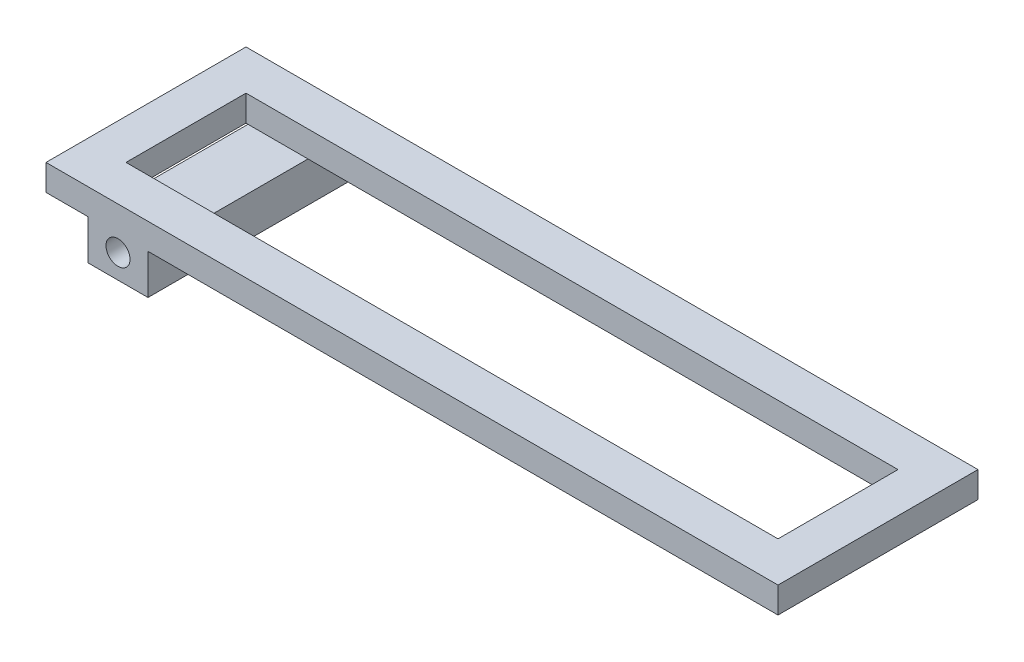
ISO-10303-21;
HEADER;
FILE_DESCRIPTION(('STEP AP214'),'2;1');
FILE_NAME('part.step','',(''),(''),'','','');
FILE_SCHEMA(('AUTOMOTIVE_DESIGN { 1 0 10303 214 1 1 1 1 }'));
ENDSEC;
DATA;
#1=APPLICATION_CONTEXT('core data for automotive mechanical design processes');
#2=APPLICATION_PROTOCOL_DEFINITION('international standard','automotive_design',2000,#1);
#3=PRODUCT_CONTEXT('',#1,'mechanical');
#4=PRODUCT('Part','Part','',(#3));
#5=PRODUCT_RELATED_PRODUCT_CATEGORY('part','',(#4));
#6=PRODUCT_DEFINITION_FORMATION('','',#4);
#7=PRODUCT_DEFINITION_CONTEXT('part definition',#1,'design');
#8=PRODUCT_DEFINITION('design','',#6,#7);
#9=PRODUCT_DEFINITION_SHAPE('','',#8);
#10=(LENGTH_UNIT() NAMED_UNIT(*) SI_UNIT(.MILLI.,.METRE.));
#11=(NAMED_UNIT(*) PLANE_ANGLE_UNIT() SI_UNIT($,.RADIAN.));
#12=(NAMED_UNIT(*) SI_UNIT($,.STERADIAN.) SOLID_ANGLE_UNIT());
#13=UNCERTAINTY_MEASURE_WITH_UNIT(LENGTH_MEASURE(1.E-05),#10,'distance_accuracy_value','');
#14=(GEOMETRIC_REPRESENTATION_CONTEXT(3) GLOBAL_UNCERTAINTY_ASSIGNED_CONTEXT((#13)) GLOBAL_UNIT_ASSIGNED_CONTEXT((#10,
#11,#12)) REPRESENTATION_CONTEXT('',''));
#15=CARTESIAN_POINT('',(0.,0.,0.));
#16=DIRECTION('',(0.,0.,1.));
#17=DIRECTION('',(1.,0.,0.));
#18=AXIS2_PLACEMENT_3D('',#15,#16,#17);
#19=CARTESIAN_POINT('',(0.,0.,-10.));
#20=DIRECTION('',(0.,-1.,0.));
#21=DIRECTION('',(0.,0.,-1.));
#22=AXIS2_PLACEMENT_3D('',#19,#20,#21);
#23=PLANE('',#22);
#24=DIRECTION('',(1.,0.,0.));
#25=VECTOR('',#24,1.);
#26=CARTESIAN_POINT('',(0.,0.,0.));
#27=LINE('',#26,#25);
#28=CARTESIAN_POINT('',(25.5,0.,0.));
#29=VERTEX_POINT('',#28);
#30=CARTESIAN_POINT('',(183.,0.,0.));
#31=VERTEX_POINT('',#30);
#32=EDGE_CURVE('E228',#29,#31,#27,.T.);
#33=ORIENTED_EDGE('',*,*,#32,.F.);
#34=DIRECTION('',(0.,0.,-1.));
#35=VECTOR('',#34,1.);
#36=CARTESIAN_POINT('',(25.5,0.,0.));
#37=LINE('',#36,#35);
#38=CARTESIAN_POINT('',(25.5,0.,-10.));
#39=VERTEX_POINT('',#38);
#40=EDGE_CURVE('E167',#29,#39,#37,.T.);
#41=ORIENTED_EDGE('',*,*,#40,.T.);
#42=DIRECTION('',(1.,0.,0.));
#43=VECTOR('',#42,1.);
#44=CARTESIAN_POINT('',(0.,0.,-10.));
#45=LINE('',#44,#43);
#46=CARTESIAN_POINT('',(173.,0.,-10.));
#47=VERTEX_POINT('',#46);
#48=EDGE_CURVE('E216',#39,#47,#45,.T.);
#49=ORIENTED_EDGE('',*,*,#48,.T.);
#50=DIRECTION('',(0.,0.,1.));
#51=VECTOR('',#50,1.);
#52=CARTESIAN_POINT('',(173.,0.,-50.));
#53=LINE('',#52,#51);
#54=CARTESIAN_POINT('',(173.,0.,-40.));
#55=VERTEX_POINT('',#54);
#56=EDGE_CURVE('E209',#55,#47,#53,.T.);
#57=ORIENTED_EDGE('',*,*,#56,.F.);
#58=DIRECTION('',(-1.,0.,0.));
#59=VECTOR('',#58,1.);
#60=CARTESIAN_POINT('',(183.002,0.,-40.));
#61=LINE('',#60,#59);
#62=CARTESIAN_POINT('',(25.5,0.,-40.));
#63=VERTEX_POINT('',#62);
#64=EDGE_CURVE('E179',#55,#63,#61,.T.);
#65=ORIENTED_EDGE('',*,*,#64,.T.);
#66=CARTESIAN_POINT('',(25.5,0.,-50.));
#67=VERTEX_POINT('',#66);
#68=EDGE_CURVE('E44',#63,#67,#37,.T.);
#69=ORIENTED_EDGE('',*,*,#68,.T.);
#70=DIRECTION('',(-1.,0.,0.));
#71=VECTOR('',#70,1.);
#72=CARTESIAN_POINT('',(183.,0.,-50.));
#73=LINE('',#72,#71);
#74=CARTESIAN_POINT('',(183.,0.,-50.));
#75=VERTEX_POINT('',#74);
#76=EDGE_CURVE('E155',#75,#67,#73,.T.);
#77=ORIENTED_EDGE('',*,*,#76,.F.);
#78=DIRECTION('',(0.,0.,1.));
#79=VECTOR('',#78,1.);
#80=CARTESIAN_POINT('',(183.,0.,-10.));
#81=LINE('',#80,#79);
#82=EDGE_CURVE('E236',#75,#31,#81,.T.);
#83=ORIENTED_EDGE('',*,*,#82,.T.);
#84=EDGE_LOOP('',(#33,#41,#49,#57,#65,#69,#77,#83));
#85=FACE_BOUND('',#84,.T.);
#86=ADVANCED_FACE('F35',(#85),#23,.T.);
#87=CARTESIAN_POINT('',(173.,6.5,-50.));
#88=DIRECTION('',(1.,0.,0.));
#89=DIRECTION('',(0.,0.,-1.));
#90=AXIS2_PLACEMENT_3D('',#87,#88,#89);
#91=PLANE('',#90);
#92=DIRECTION('',(0.,-1.,0.));
#93=VECTOR('',#92,1.);
#94=CARTESIAN_POINT('',(173.,6.49999999999995,-40.));
#95=LINE('',#94,#93);
#96=CARTESIAN_POINT('',(173.,6.49999999999996,-40.));
#97=VERTEX_POINT('',#96);
#98=EDGE_CURVE('E156',#97,#55,#95,.T.);
#99=ORIENTED_EDGE('',*,*,#98,.T.);
#100=ORIENTED_EDGE('',*,*,#56,.T.);
#101=DIRECTION('',(0.,1.,0.));
#102=VECTOR('',#101,1.);
#103=CARTESIAN_POINT('',(173.,6.5,-10.));
#104=LINE('',#103,#102);
#105=CARTESIAN_POINT('',(173.,6.5,-10.));
#106=VERTEX_POINT('',#105);
#107=EDGE_CURVE('E197',#47,#106,#104,.T.);
#108=ORIENTED_EDGE('',*,*,#107,.T.);
#109=DIRECTION('',(0.,0.,1.));
#110=VECTOR('',#109,1.);
#111=CARTESIAN_POINT('',(173.,6.5,-50.));
#112=LINE('',#111,#110);
#113=EDGE_CURVE('E205',#97,#106,#112,.T.);
#114=ORIENTED_EDGE('',*,*,#113,.F.);
#115=EDGE_LOOP('',(#99,#100,#108,#114));
#116=FACE_BOUND('',#115,.T.);
#117=ADVANCED_FACE('F265',(#116),#91,.F.);
#118=CARTESIAN_POINT('',(10.,6.5,-50.));
#119=DIRECTION('',(-1.,0.,0.));
#120=DIRECTION('',(0.,-1.,0.));
#121=AXIS2_PLACEMENT_3D('',#118,#119,#120);
#122=PLANE('',#121);
#123=DIRECTION('',(0.,-1.,0.));
#124=VECTOR('',#123,1.);
#125=CARTESIAN_POINT('',(10.,6.5,-40.));
#126=LINE('',#125,#124);
#127=CARTESIAN_POINT('',(10.,6.5,-40.));
#128=VERTEX_POINT('',#127);
#129=CARTESIAN_POINT('',(10.,0.,-40.));
#130=VERTEX_POINT('',#129);
#131=EDGE_CURVE('E175',#128,#130,#126,.T.);
#132=ORIENTED_EDGE('',*,*,#131,.F.);
#133=DIRECTION('',(0.,0.,1.));
#134=VECTOR('',#133,1.);
#135=CARTESIAN_POINT('',(10.,6.5,-50.));
#136=LINE('',#135,#134);
#137=CARTESIAN_POINT('',(10.,6.5,-10.));
#138=VERTEX_POINT('',#137);
#139=EDGE_CURVE('E195',#128,#138,#136,.T.);
#140=ORIENTED_EDGE('',*,*,#139,.T.);
#141=DIRECTION('',(0.,-1.,0.));
#142=VECTOR('',#141,1.);
#143=CARTESIAN_POINT('',(10.,6.5,-10.));
#144=LINE('',#143,#142);
#145=CARTESIAN_POINT('',(10.,0.,-10.));
#146=VERTEX_POINT('',#145);
#147=EDGE_CURVE('E178',#138,#146,#144,.T.);
#148=ORIENTED_EDGE('',*,*,#147,.T.);
#149=DIRECTION('',(0.,0.,1.));
#150=VECTOR('',#149,1.);
#151=CARTESIAN_POINT('',(10.,0.,-50.));
#152=LINE('',#151,#150);
#153=EDGE_CURVE('E191',#130,#146,#152,.T.);
#154=ORIENTED_EDGE('',*,*,#153,.F.);
#155=EDGE_LOOP('',(#132,#140,#148,#154));
#156=FACE_BOUND('',#155,.T.);
#157=ADVANCED_FACE('F271',(#156),#122,.F.);
#158=CARTESIAN_POINT('',(0.,0.,-10.));
#159=DIRECTION('',(0.,0.,1.));
#160=DIRECTION('',(1.,0.,0.));
#161=AXIS2_PLACEMENT_3D('',#158,#159,#160);
#162=PLANE('',#161);
#163=ORIENTED_EDGE('',*,*,#147,.F.);
#164=DIRECTION('',(1.,0.,0.));
#165=VECTOR('',#164,1.);
#166=CARTESIAN_POINT('',(0.,6.5,-10.));
#167=LINE('',#166,#165);
#168=EDGE_CURVE('E213',#138,#106,#167,.T.);
#169=ORIENTED_EDGE('',*,*,#168,.T.);
#170=ORIENTED_EDGE('',*,*,#107,.F.);
#171=ORIENTED_EDGE('',*,*,#48,.F.);
#172=CARTESIAN_POINT('',(10.5,0.,-10.));
#173=VERTEX_POINT('',#172);
#174=EDGE_CURVE('E222',#173,#39,#45,.T.);
#175=ORIENTED_EDGE('',*,*,#174,.F.);
#176=EDGE_CURVE('E218',#146,#173,#45,.T.);
#177=ORIENTED_EDGE('',*,*,#176,.F.);
#178=EDGE_LOOP('',(#163,#169,#170,#171,#175,#177));
#179=FACE_BOUND('',#178,.T.);
#180=ADVANCED_FACE('F303',(#179),#162,.F.);
#181=CARTESIAN_POINT('',(0.,6.5,-10.));
#182=DIRECTION('',(0.,-1.,0.));
#183=DIRECTION('',(0.,0.,-1.));
#184=AXIS2_PLACEMENT_3D('',#181,#182,#183);
#185=PLANE('',#184);
#186=DIRECTION('',(-1.,0.,0.));
#187=VECTOR('',#186,1.);
#188=CARTESIAN_POINT('',(183.002,6.49999999999995,-40.));
#189=LINE('',#188,#187);
#190=EDGE_CURVE('E180',#97,#128,#189,.T.);
#191=ORIENTED_EDGE('',*,*,#190,.F.);
#192=ORIENTED_EDGE('',*,*,#113,.T.);
#193=ORIENTED_EDGE('',*,*,#168,.F.);
#194=ORIENTED_EDGE('',*,*,#139,.F.);
#195=EDGE_LOOP('',(#191,#192,#193,#194));
#196=FACE_BOUND('',#195,.T.);
#197=DIRECTION('',(1.,0.,0.));
#198=VECTOR('',#197,1.);
#199=CARTESIAN_POINT('',(0.,6.5,0.));
#200=LINE('',#199,#198);
#201=CARTESIAN_POINT('',(0.,6.5,0.));
#202=VERTEX_POINT('',#201);
#203=CARTESIAN_POINT('',(183.,6.5,0.));
#204=VERTEX_POINT('',#203);
#205=EDGE_CURVE('E212',#202,#204,#200,.T.);
#206=ORIENTED_EDGE('',*,*,#205,.T.);
#207=DIRECTION('',(0.,0.,1.));
#208=VECTOR('',#207,1.);
#209=CARTESIAN_POINT('',(183.,6.5,-10.));
#210=LINE('',#209,#208);
#211=CARTESIAN_POINT('',(183.,6.5,-50.));
#212=VERTEX_POINT('',#211);
#213=EDGE_CURVE('E39',#212,#204,#210,.T.);
#214=ORIENTED_EDGE('',*,*,#213,.F.);
#215=DIRECTION('',(1.,0.,0.));
#216=VECTOR('',#215,1.);
#217=CARTESIAN_POINT('',(183.,6.5,-50.));
#218=LINE('',#217,#216);
#219=CARTESIAN_POINT('',(0.,6.5,-50.));
#220=VERTEX_POINT('',#219);
#221=EDGE_CURVE('E202',#220,#212,#218,.T.);
#222=ORIENTED_EDGE('',*,*,#221,.F.);
#223=DIRECTION('',(0.,0.,1.));
#224=VECTOR('',#223,1.);
#225=CARTESIAN_POINT('',(0.,6.5,-10.));
#226=LINE('',#225,#224);
#227=EDGE_CURVE('E221',#220,#202,#226,.T.);
#228=ORIENTED_EDGE('',*,*,#227,.T.);
#229=EDGE_LOOP('',(#206,#214,#222,#228));
#230=FACE_BOUND('',#229,.T.);
#231=ADVANCED_FACE('F37',(#196,#230),#185,.F.);
#232=CARTESIAN_POINT('',(183.,0.,-10.));
#233=DIRECTION('',(1.,0.,0.));
#234=DIRECTION('',(0.,0.,-1.));
#235=AXIS2_PLACEMENT_3D('',#232,#233,#234);
#236=PLANE('',#235);
#237=DIRECTION('',(0.,1.,0.));
#238=VECTOR('',#237,1.);
#239=CARTESIAN_POINT('',(183.,0.,0.));
#240=LINE('',#239,#238);
#241=EDGE_CURVE('E225',#31,#204,#240,.T.);
#242=ORIENTED_EDGE('',*,*,#241,.F.);
#243=ORIENTED_EDGE('',*,*,#82,.F.);
#244=DIRECTION('',(0.,-1.,0.));
#245=VECTOR('',#244,1.);
#246=CARTESIAN_POINT('',(183.,6.5,-50.));
#247=LINE('',#246,#245);
#248=EDGE_CURVE('E198',#212,#75,#247,.T.);
#249=ORIENTED_EDGE('',*,*,#248,.F.);
#250=ORIENTED_EDGE('',*,*,#213,.T.);
#251=EDGE_LOOP('',(#242,#243,#249,#250));
#252=FACE_BOUND('',#251,.T.);
#253=ADVANCED_FACE('F277',(#252),#236,.T.);
#254=DIRECTION('',(0.,0.,-1.));
#255=VECTOR('',#254,1.);
#256=CARTESIAN_POINT('',(10.5,0.,0.));
#257=LINE('',#256,#255);
#258=CARTESIAN_POINT('',(10.5,0.,0.));
#259=VERTEX_POINT('',#258);
#260=EDGE_CURVE('E46',#259,#173,#257,.T.);
#261=ORIENTED_EDGE('',*,*,#260,.F.);
#262=CARTESIAN_POINT('',(0.,0.,0.));
#263=VERTEX_POINT('',#262);
#264=EDGE_CURVE('E229',#263,#259,#27,.T.);
#265=ORIENTED_EDGE('',*,*,#264,.F.);
#266=DIRECTION('',(0.,0.,1.));
#267=VECTOR('',#266,1.);
#268=CARTESIAN_POINT('',(0.,0.,-10.));
#269=LINE('',#268,#267);
#270=CARTESIAN_POINT('',(0.,0.,-50.));
#271=VERTEX_POINT('',#270);
#272=EDGE_CURVE('E235',#271,#263,#269,.T.);
#273=ORIENTED_EDGE('',*,*,#272,.F.);
#274=CARTESIAN_POINT('',(10.5,0.,-50.));
#275=VERTEX_POINT('',#274);
#276=EDGE_CURVE('E200',#275,#271,#73,.T.);
#277=ORIENTED_EDGE('',*,*,#276,.F.);
#278=CARTESIAN_POINT('',(10.5,0.,-40.));
#279=VERTEX_POINT('',#278);
#280=EDGE_CURVE('E11',#279,#275,#257,.T.);
#281=ORIENTED_EDGE('',*,*,#280,.F.);
#282=EDGE_CURVE('E182',#279,#130,#61,.T.);
#283=ORIENTED_EDGE('',*,*,#282,.T.);
#284=ORIENTED_EDGE('',*,*,#153,.T.);
#285=ORIENTED_EDGE('',*,*,#176,.T.);
#286=EDGE_LOOP('',(#261,#265,#273,#277,#281,#283,#284,#285));
#287=FACE_BOUND('',#286,.T.);
#288=ADVANCED_FACE('F267',(#287),#23,.T.);
#289=CARTESIAN_POINT('',(0.,0.,-10.));
#290=DIRECTION('',(1.,0.,0.));
#291=DIRECTION('',(0.,0.,-1.));
#292=AXIS2_PLACEMENT_3D('',#289,#290,#291);
#293=PLANE('',#292);
#294=DIRECTION('',(0.,1.,0.));
#295=VECTOR('',#294,1.);
#296=CARTESIAN_POINT('',(0.,0.,0.));
#297=LINE('',#296,#295);
#298=EDGE_CURVE('E217',#263,#202,#297,.T.);
#299=ORIENTED_EDGE('',*,*,#298,.T.);
#300=ORIENTED_EDGE('',*,*,#227,.F.);
#301=DIRECTION('',(0.,1.,0.));
#302=VECTOR('',#301,1.);
#303=CARTESIAN_POINT('',(0.,6.5,-50.));
#304=LINE('',#303,#302);
#305=EDGE_CURVE('E188',#271,#220,#304,.T.);
#306=ORIENTED_EDGE('',*,*,#305,.F.);
#307=ORIENTED_EDGE('',*,*,#272,.T.);
#308=EDGE_LOOP('',(#299,#300,#306,#307));
#309=FACE_BOUND('',#308,.T.);
#310=ADVANCED_FACE('F276',(#309),#293,.F.);
#311=CARTESIAN_POINT('',(0.,0.,0.));
#312=DIRECTION('',(0.,0.,1.));
#313=DIRECTION('',(1.,0.,0.));
#314=AXIS2_PLACEMENT_3D('',#311,#312,#313);
#315=PLANE('',#314);
#316=CARTESIAN_POINT('',(18.,-4.,0.));
#317=DIRECTION('',(0.,0.,1.));
#318=DIRECTION('',(1.,0.,0.));
#319=AXIS2_PLACEMENT_3D('',#316,#317,#318);
#320=CIRCLE('',#319,3.);
#321=CARTESIAN_POINT('',(21.,-4.,0.));
#322=VERTEX_POINT('',#321);
#323=EDGE_CURVE('E243',#322,#322,#320,.T.);
#324=ORIENTED_EDGE('',*,*,#323,.F.);
#325=EDGE_LOOP('',(#324));
#326=FACE_BOUND('',#325,.T.);
#327=ORIENTED_EDGE('',*,*,#205,.F.);
#328=ORIENTED_EDGE('',*,*,#298,.F.);
#329=ORIENTED_EDGE('',*,*,#264,.T.);
#330=DIRECTION('',(0.,1.,0.));
#331=VECTOR('',#330,1.);
#332=CARTESIAN_POINT('',(10.5,-10.,0.));
#333=LINE('',#332,#331);
#334=CARTESIAN_POINT('',(10.5,-10.,0.));
#335=VERTEX_POINT('',#334);
#336=EDGE_CURVE('E172',#335,#259,#333,.T.);
#337=ORIENTED_EDGE('',*,*,#336,.F.);
#338=DIRECTION('',(1.,0.,0.));
#339=VECTOR('',#338,1.);
#340=CARTESIAN_POINT('',(10.5,-10.,0.));
#341=LINE('',#340,#339);
#342=CARTESIAN_POINT('',(25.5,-10.,0.));
#343=VERTEX_POINT('',#342);
#344=EDGE_CURVE('E160',#335,#343,#341,.T.);
#345=ORIENTED_EDGE('',*,*,#344,.T.);
#346=DIRECTION('',(0.,1.,0.));
#347=VECTOR('',#346,1.);
#348=CARTESIAN_POINT('',(25.5,-10.,0.));
#349=LINE('',#348,#347);
#350=EDGE_CURVE('E157',#343,#29,#349,.T.);
#351=ORIENTED_EDGE('',*,*,#350,.T.);
#352=ORIENTED_EDGE('',*,*,#32,.T.);
#353=ORIENTED_EDGE('',*,*,#241,.T.);
#354=EDGE_LOOP('',(#327,#328,#329,#337,#345,#351,#352,#353));
#355=FACE_BOUND('',#354,.T.);
#356=ADVANCED_FACE('F283',(#326,#355),#315,.T.);
#357=CARTESIAN_POINT('',(0.,0.,-50.));
#358=DIRECTION('',(0.,0.,-1.));
#359=DIRECTION('',(-1.,0.,0.));
#360=AXIS2_PLACEMENT_3D('',#357,#358,#359);
#361=PLANE('',#360);
#362=CARTESIAN_POINT('',(18.,-4.,-50.));
#363=DIRECTION('',(0.,0.,-1.));
#364=DIRECTION('',(-1.,0.,0.));
#365=AXIS2_PLACEMENT_3D('',#362,#363,#364);
#366=CIRCLE('',#365,3.);
#367=CARTESIAN_POINT('',(15.,-4.,-50.));
#368=VERTEX_POINT('',#367);
#369=EDGE_CURVE('E247',#368,#368,#366,.F.);
#370=ORIENTED_EDGE('',*,*,#369,.T.);
#371=EDGE_LOOP('',(#370));
#372=FACE_BOUND('',#371,.T.);
#373=ORIENTED_EDGE('',*,*,#248,.T.);
#374=ORIENTED_EDGE('',*,*,#76,.T.);
#375=DIRECTION('',(0.,1.,0.));
#376=VECTOR('',#375,1.);
#377=CARTESIAN_POINT('',(25.5,-10.,-50.));
#378=LINE('',#377,#376);
#379=CARTESIAN_POINT('',(25.5,-10.,-50.));
#380=VERTEX_POINT('',#379);
#381=EDGE_CURVE('E54',#380,#67,#378,.T.);
#382=ORIENTED_EDGE('',*,*,#381,.F.);
#383=DIRECTION('',(1.,0.,0.));
#384=VECTOR('',#383,1.);
#385=CARTESIAN_POINT('',(10.5,-10.,-50.));
#386=LINE('',#385,#384);
#387=CARTESIAN_POINT('',(10.5,-10.,-50.));
#388=VERTEX_POINT('',#387);
#389=EDGE_CURVE('E140',#388,#380,#386,.T.);
#390=ORIENTED_EDGE('',*,*,#389,.F.);
#391=DIRECTION('',(0.,1.,0.));
#392=VECTOR('',#391,1.);
#393=CARTESIAN_POINT('',(10.5,-10.,-50.));
#394=LINE('',#393,#392);
#395=EDGE_CURVE('E166',#388,#275,#394,.T.);
#396=ORIENTED_EDGE('',*,*,#395,.T.);
#397=ORIENTED_EDGE('',*,*,#276,.T.);
#398=ORIENTED_EDGE('',*,*,#305,.T.);
#399=ORIENTED_EDGE('',*,*,#221,.T.);
#400=EDGE_LOOP('',(#373,#374,#382,#390,#396,#397,#398,#399));
#401=FACE_BOUND('',#400,.T.);
#402=ADVANCED_FACE('F153',(#372,#401),#361,.T.);
#403=CARTESIAN_POINT('',(183.002,6.49999999999995,-40.));
#404=DIRECTION('',(0.,0.,-1.));
#405=DIRECTION('',(-1.,0.,0.));
#406=AXIS2_PLACEMENT_3D('',#403,#404,#405);
#407=PLANE('',#406);
#408=ORIENTED_EDGE('',*,*,#98,.F.);
#409=ORIENTED_EDGE('',*,*,#190,.T.);
#410=ORIENTED_EDGE('',*,*,#131,.T.);
#411=ORIENTED_EDGE('',*,*,#282,.F.);
#412=EDGE_CURVE('E185',#63,#279,#61,.T.);
#413=ORIENTED_EDGE('',*,*,#412,.F.);
#414=ORIENTED_EDGE('',*,*,#64,.F.);
#415=EDGE_LOOP('',(#408,#409,#410,#411,#413,#414));
#416=FACE_BOUND('',#415,.T.);
#417=ADVANCED_FACE('F309',(#416),#407,.F.);
#418=CARTESIAN_POINT('',(25.5,-10.,0.));
#419=DIRECTION('',(1.,0.,0.));
#420=DIRECTION('',(0.,0.,-1.));
#421=AXIS2_PLACEMENT_3D('',#418,#419,#420);
#422=PLANE('',#421);
#423=ORIENTED_EDGE('',*,*,#40,.F.);
#424=ORIENTED_EDGE('',*,*,#350,.F.);
#425=DIRECTION('',(0.,0.,-1.));
#426=VECTOR('',#425,1.);
#427=CARTESIAN_POINT('',(25.5,-10.,0.));
#428=LINE('',#427,#426);
#429=EDGE_CURVE('E143',#343,#380,#428,.T.);
#430=ORIENTED_EDGE('',*,*,#429,.T.);
#431=ORIENTED_EDGE('',*,*,#381,.T.);
#432=ORIENTED_EDGE('',*,*,#68,.F.);
#433=EDGE_CURVE('E60',#39,#63,#37,.T.);
#434=ORIENTED_EDGE('',*,*,#433,.F.);
#435=EDGE_LOOP('',(#423,#424,#430,#431,#432,#434));
#436=FACE_BOUND('',#435,.T.);
#437=ADVANCED_FACE('F159',(#436),#422,.T.);
#438=CARTESIAN_POINT('',(10.5,-10.,0.));
#439=DIRECTION('',(1.,0.,0.));
#440=DIRECTION('',(0.,0.,-1.));
#441=AXIS2_PLACEMENT_3D('',#438,#439,#440);
#442=PLANE('',#441);
#443=ORIENTED_EDGE('',*,*,#260,.T.);
#444=EDGE_CURVE('E47',#173,#279,#257,.T.);
#445=ORIENTED_EDGE('',*,*,#444,.T.);
#446=ORIENTED_EDGE('',*,*,#280,.T.);
#447=ORIENTED_EDGE('',*,*,#395,.F.);
#448=DIRECTION('',(0.,0.,-1.));
#449=VECTOR('',#448,1.);
#450=CARTESIAN_POINT('',(10.5,-10.,0.));
#451=LINE('',#450,#449);
#452=EDGE_CURVE('E146',#335,#388,#451,.T.);
#453=ORIENTED_EDGE('',*,*,#452,.F.);
#454=ORIENTED_EDGE('',*,*,#336,.T.);
#455=EDGE_LOOP('',(#443,#445,#446,#447,#453,#454));
#456=FACE_BOUND('',#455,.T.);
#457=ADVANCED_FACE('F305',(#456),#442,.F.);
#458=CARTESIAN_POINT('',(0.,-10.,0.));
#459=DIRECTION('',(0.,1.,0.));
#460=DIRECTION('',(0.,0.,1.));
#461=AXIS2_PLACEMENT_3D('',#458,#459,#460);
#462=PLANE('',#461);
#463=ORIENTED_EDGE('',*,*,#389,.T.);
#464=ORIENTED_EDGE('',*,*,#429,.F.);
#465=ORIENTED_EDGE('',*,*,#344,.F.);
#466=ORIENTED_EDGE('',*,*,#452,.T.);
#467=EDGE_LOOP('',(#463,#464,#465,#466));
#468=FACE_BOUND('',#467,.T.);
#469=ADVANCED_FACE('F141',(#468),#462,.F.);
#470=CARTESIAN_POINT('',(0.,0.,0.));
#471=DIRECTION('',(0.,1.,0.));
#472=DIRECTION('',(0.,0.,1.));
#473=AXIS2_PLACEMENT_3D('',#470,#471,#472);
#474=PLANE('',#473);
#475=ORIENTED_EDGE('',*,*,#433,.T.);
#476=ORIENTED_EDGE('',*,*,#412,.T.);
#477=ORIENTED_EDGE('',*,*,#444,.F.);
#478=ORIENTED_EDGE('',*,*,#174,.T.);
#479=EDGE_LOOP('',(#475,#476,#477,#478));
#480=FACE_BOUND('',#479,.T.);
#481=ADVANCED_FACE('F257',(#480),#474,.T.);
#482=CARTESIAN_POINT('',(18.,-4.,-50.001));
#483=DIRECTION('',(0.,0.,1.));
#484=DIRECTION('',(1.,0.,0.));
#485=AXIS2_PLACEMENT_3D('',#482,#483,#484);
#486=CYLINDRICAL_SURFACE('',#485,3.);
#487=ORIENTED_EDGE('',*,*,#369,.F.);
#488=EDGE_LOOP('',(#487));
#489=FACE_BOUND('',#488,.T.);
#490=ORIENTED_EDGE('',*,*,#323,.T.);
#491=EDGE_LOOP('',(#490));
#492=FACE_BOUND('',#491,.T.);
#493=ADVANCED_FACE('F255',(#489,#492),#486,.F.);
#494=CLOSED_SHELL('',(#86,#117,#157,#180,#231,#253,#288,#310,#356,#402,#417,#437,#457,#469,#481,#493));
#495=MANIFOLD_SOLID_BREP('B2',#494);
#496=ADVANCED_BREP_SHAPE_REPRESENTATION('',(#18,#495),#14);
#497=SHAPE_DEFINITION_REPRESENTATION(#9,#496);
ENDSEC;
END-ISO-10303-21;
